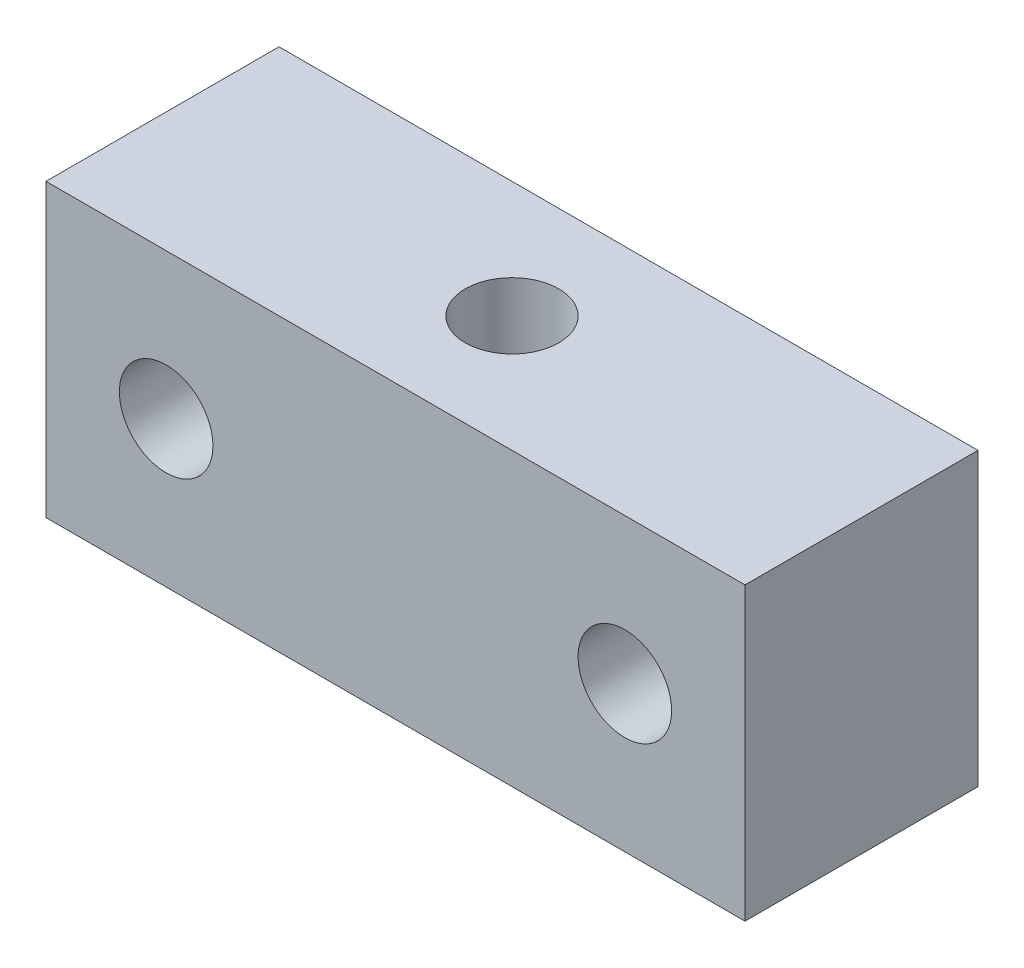
ISO-10303-21;
HEADER;
FILE_DESCRIPTION(('STEP AP214'),'2;1');
FILE_NAME('part.step','',(''),(''),'','','');
FILE_SCHEMA(('AUTOMOTIVE_DESIGN { 1 0 10303 214 1 1 1 1 }'));
ENDSEC;
DATA;
#1=APPLICATION_CONTEXT('core data for automotive mechanical design processes');
#2=APPLICATION_PROTOCOL_DEFINITION('international standard','automotive_design',2000,#1);
#3=PRODUCT_CONTEXT('',#1,'mechanical');
#4=PRODUCT('Part','Part','',(#3));
#5=PRODUCT_RELATED_PRODUCT_CATEGORY('part','',(#4));
#6=PRODUCT_DEFINITION_FORMATION('','',#4);
#7=PRODUCT_DEFINITION_CONTEXT('part definition',#1,'design');
#8=PRODUCT_DEFINITION('design','',#6,#7);
#9=PRODUCT_DEFINITION_SHAPE('','',#8);
#10=(LENGTH_UNIT() NAMED_UNIT(*) SI_UNIT(.MILLI.,.METRE.));
#11=(NAMED_UNIT(*) PLANE_ANGLE_UNIT() SI_UNIT($,.RADIAN.));
#12=(NAMED_UNIT(*) SI_UNIT($,.STERADIAN.) SOLID_ANGLE_UNIT());
#13=UNCERTAINTY_MEASURE_WITH_UNIT(LENGTH_MEASURE(1.E-05),#10,'distance_accuracy_value','');
#14=(GEOMETRIC_REPRESENTATION_CONTEXT(3) GLOBAL_UNCERTAINTY_ASSIGNED_CONTEXT((#13)) GLOBAL_UNIT_ASSIGNED_CONTEXT((#10,
#11,#12)) REPRESENTATION_CONTEXT('',''));
#15=CARTESIAN_POINT('',(0.,0.,0.));
#16=DIRECTION('',(0.,0.,1.));
#17=DIRECTION('',(1.,0.,0.));
#18=AXIS2_PLACEMENT_3D('',#15,#16,#17);
#19=CARTESIAN_POINT('',(0.,0.,25.4));
#20=DIRECTION('',(1.,0.,0.));
#21=DIRECTION('',(0.,0.,-1.));
#22=AXIS2_PLACEMENT_3D('',#19,#20,#21);
#23=PLANE('',#22);
#24=DIRECTION('',(0.,-1.,0.));
#25=VECTOR('',#24,1.);
#26=CARTESIAN_POINT('',(0.,0.,0.));
#27=LINE('',#26,#25);
#28=CARTESIAN_POINT('',(0.,31.75,0.));
#29=VERTEX_POINT('',#28);
#30=CARTESIAN_POINT('',(0.,0.,0.));
#31=VERTEX_POINT('',#30);
#32=EDGE_CURVE('E99',#29,#31,#27,.T.);
#33=ORIENTED_EDGE('',*,*,#32,.T.);
#34=DIRECTION('',(0.,0.,-1.));
#35=VECTOR('',#34,1.);
#36=CARTESIAN_POINT('',(0.,0.,25.4));
#37=LINE('',#36,#35);
#38=CARTESIAN_POINT('',(0.,0.,25.4));
#39=VERTEX_POINT('',#38);
#40=EDGE_CURVE('E11',#39,#31,#37,.T.);
#41=ORIENTED_EDGE('',*,*,#40,.F.);
#42=DIRECTION('',(0.,-1.,0.));
#43=VECTOR('',#42,1.);
#44=CARTESIAN_POINT('',(0.,0.,25.4));
#45=LINE('',#44,#43);
#46=CARTESIAN_POINT('',(0.,31.75,25.4));
#47=VERTEX_POINT('',#46);
#48=EDGE_CURVE('E87',#47,#39,#45,.T.);
#49=ORIENTED_EDGE('',*,*,#48,.F.);
#50=DIRECTION('',(0.,0.,-1.));
#51=VECTOR('',#50,1.);
#52=CARTESIAN_POINT('',(0.,31.75,25.4));
#53=LINE('',#52,#51);
#54=EDGE_CURVE('E95',#47,#29,#53,.T.);
#55=ORIENTED_EDGE('',*,*,#54,.T.);
#56=EDGE_LOOP('',(#33,#41,#49,#55));
#57=FACE_BOUND('',#56,.T.);
#58=ADVANCED_FACE('F36',(#57),#23,.F.);
#59=CARTESIAN_POINT('',(0.,0.,25.4));
#60=DIRECTION('',(0.,1.,0.));
#61=DIRECTION('',(0.,0.,1.));
#62=AXIS2_PLACEMENT_3D('',#59,#60,#61);
#63=PLANE('',#62);
#64=CARTESIAN_POINT('',(38.1,1.59594559789866E-13,12.7));
#65=DIRECTION('',(0.,1.,0.));
#66=DIRECTION('',(0.,0.,1.));
#67=AXIS2_PLACEMENT_3D('',#64,#65,#66);
#68=CIRCLE('',#67,5.09999999999999);
#69=CARTESIAN_POINT('',(38.1,1.59311452918587E-13,17.8));
#70=VERTEX_POINT('',#69);
#71=EDGE_CURVE('E124',#70,#70,#68,.T.);
#72=ORIENTED_EDGE('',*,*,#71,.T.);
#73=EDGE_LOOP('',(#72));
#74=FACE_BOUND('',#73,.T.);
#75=DIRECTION('',(1.,0.,0.));
#76=VECTOR('',#75,1.);
#77=CARTESIAN_POINT('',(0.,0.,0.));
#78=LINE('',#77,#76);
#79=CARTESIAN_POINT('',(76.2,0.,0.));
#80=VERTEX_POINT('',#79);
#81=EDGE_CURVE('E91',#31,#80,#78,.T.);
#82=ORIENTED_EDGE('',*,*,#81,.T.);
#83=DIRECTION('',(0.,0.,-1.));
#84=VECTOR('',#83,1.);
#85=CARTESIAN_POINT('',(76.2,0.,25.4));
#86=LINE('',#85,#84);
#87=CARTESIAN_POINT('',(76.2,0.,25.4));
#88=VERTEX_POINT('',#87);
#89=EDGE_CURVE('E44',#88,#80,#86,.T.);
#90=ORIENTED_EDGE('',*,*,#89,.F.);
#91=DIRECTION('',(1.,0.,0.));
#92=VECTOR('',#91,1.);
#93=CARTESIAN_POINT('',(0.,0.,25.4));
#94=LINE('',#93,#92);
#95=EDGE_CURVE('E82',#39,#88,#94,.T.);
#96=ORIENTED_EDGE('',*,*,#95,.F.);
#97=ORIENTED_EDGE('',*,*,#40,.T.);
#98=EDGE_LOOP('',(#82,#90,#96,#97));
#99=FACE_BOUND('',#98,.T.);
#100=ADVANCED_FACE('F90',(#74,#99),#63,.F.);
#101=CARTESIAN_POINT('',(76.2,0.,25.4));
#102=DIRECTION('',(-1.,0.,0.));
#103=DIRECTION('',(0.,0.,1.));
#104=AXIS2_PLACEMENT_3D('',#101,#102,#103);
#105=PLANE('',#104);
#106=DIRECTION('',(0.,1.,0.));
#107=VECTOR('',#106,1.);
#108=CARTESIAN_POINT('',(76.2,0.,0.));
#109=LINE('',#108,#107);
#110=CARTESIAN_POINT('',(76.2,31.75,0.));
#111=VERTEX_POINT('',#110);
#112=EDGE_CURVE('E69',#80,#111,#109,.T.);
#113=ORIENTED_EDGE('',*,*,#112,.T.);
#114=DIRECTION('',(0.,0.,-1.));
#115=VECTOR('',#114,1.);
#116=CARTESIAN_POINT('',(76.2,31.75,25.4));
#117=LINE('',#116,#115);
#118=CARTESIAN_POINT('',(76.2,31.75,25.4));
#119=VERTEX_POINT('',#118);
#120=EDGE_CURVE('E92',#119,#111,#117,.T.);
#121=ORIENTED_EDGE('',*,*,#120,.F.);
#122=DIRECTION('',(0.,1.,0.));
#123=VECTOR('',#122,1.);
#124=CARTESIAN_POINT('',(76.2,0.,25.4));
#125=LINE('',#124,#123);
#126=EDGE_CURVE('E85',#88,#119,#125,.T.);
#127=ORIENTED_EDGE('',*,*,#126,.F.);
#128=ORIENTED_EDGE('',*,*,#89,.T.);
#129=EDGE_LOOP('',(#113,#121,#127,#128));
#130=FACE_BOUND('',#129,.T.);
#131=ADVANCED_FACE('F93',(#130),#105,.F.);
#132=CARTESIAN_POINT('',(0.,31.75,25.4));
#133=DIRECTION('',(0.,-1.,0.));
#134=DIRECTION('',(0.,0.,-1.));
#135=AXIS2_PLACEMENT_3D('',#132,#133,#134);
#136=PLANE('',#135);
#137=CARTESIAN_POINT('',(38.1,31.75,12.7));
#138=DIRECTION('',(0.,1.,0.));
#139=DIRECTION('',(0.,0.,1.));
#140=AXIS2_PLACEMENT_3D('',#137,#138,#139);
#141=CIRCLE('',#140,5.09999999999999);
#142=CARTESIAN_POINT('',(38.1,31.75,17.8));
#143=VERTEX_POINT('',#142);
#144=EDGE_CURVE('E127',#143,#143,#141,.T.);
#145=ORIENTED_EDGE('',*,*,#144,.F.);
#146=EDGE_LOOP('',(#145));
#147=FACE_BOUND('',#146,.T.);
#148=DIRECTION('',(-1.,0.,0.));
#149=VECTOR('',#148,1.);
#150=CARTESIAN_POINT('',(0.,31.75,0.));
#151=LINE('',#150,#149);
#152=EDGE_CURVE('E75',#111,#29,#151,.T.);
#153=ORIENTED_EDGE('',*,*,#152,.T.);
#154=ORIENTED_EDGE('',*,*,#54,.F.);
#155=DIRECTION('',(-1.,0.,0.));
#156=VECTOR('',#155,1.);
#157=CARTESIAN_POINT('',(0.,31.75,25.4));
#158=LINE('',#157,#156);
#159=EDGE_CURVE('E52',#119,#47,#158,.T.);
#160=ORIENTED_EDGE('',*,*,#159,.F.);
#161=ORIENTED_EDGE('',*,*,#120,.T.);
#162=EDGE_LOOP('',(#153,#154,#160,#161));
#163=FACE_BOUND('',#162,.T.);
#164=ADVANCED_FACE('F107',(#147,#163),#136,.F.);
#165=CARTESIAN_POINT('',(0.,0.,25.4));
#166=DIRECTION('',(0.,0.,-1.));
#167=DIRECTION('',(-1.,0.,0.));
#168=AXIS2_PLACEMENT_3D('',#165,#166,#167);
#169=PLANE('',#168);
#170=CARTESIAN_POINT('',(13.1,15.875,25.4));
#171=DIRECTION('',(0.,0.,1.));
#172=DIRECTION('',(1.,0.,0.));
#173=AXIS2_PLACEMENT_3D('',#170,#171,#172);
#174=CIRCLE('',#173,5.09999999999999);
#175=CARTESIAN_POINT('',(18.2,15.875,25.4));
#176=VERTEX_POINT('',#175);
#177=EDGE_CURVE('E121',#176,#176,#174,.T.);
#178=ORIENTED_EDGE('',*,*,#177,.F.);
#179=EDGE_LOOP('',(#178));
#180=FACE_BOUND('',#179,.T.);
#181=CARTESIAN_POINT('',(63.1,15.875,25.4));
#182=DIRECTION('',(0.,0.,1.));
#183=DIRECTION('',(1.,0.,0.));
#184=AXIS2_PLACEMENT_3D('',#181,#182,#183);
#185=CIRCLE('',#184,5.09999999999999);
#186=CARTESIAN_POINT('',(68.2,15.875,25.4));
#187=VERTEX_POINT('',#186);
#188=EDGE_CURVE('E115',#187,#187,#185,.T.);
#189=ORIENTED_EDGE('',*,*,#188,.F.);
#190=EDGE_LOOP('',(#189));
#191=FACE_BOUND('',#190,.T.);
#192=ORIENTED_EDGE('',*,*,#48,.T.);
#193=ORIENTED_EDGE('',*,*,#95,.T.);
#194=ORIENTED_EDGE('',*,*,#126,.T.);
#195=ORIENTED_EDGE('',*,*,#159,.T.);
#196=EDGE_LOOP('',(#192,#193,#194,#195));
#197=FACE_BOUND('',#196,.T.);
#198=ADVANCED_FACE('F83',(#180,#191,#197),#169,.F.);
#199=CARTESIAN_POINT('',(0.,0.,0.));
#200=DIRECTION('',(0.,0.,-1.));
#201=DIRECTION('',(-1.,0.,0.));
#202=AXIS2_PLACEMENT_3D('',#199,#200,#201);
#203=PLANE('',#202);
#204=CARTESIAN_POINT('',(13.1,15.875,0.));
#205=DIRECTION('',(0.,0.,1.));
#206=DIRECTION('',(1.,0.,0.));
#207=AXIS2_PLACEMENT_3D('',#204,#205,#206);
#208=CIRCLE('',#207,5.09999999999999);
#209=CARTESIAN_POINT('',(18.2,15.875,0.));
#210=VERTEX_POINT('',#209);
#211=EDGE_CURVE('E118',#210,#210,#208,.T.);
#212=ORIENTED_EDGE('',*,*,#211,.T.);
#213=EDGE_LOOP('',(#212));
#214=FACE_BOUND('',#213,.T.);
#215=CARTESIAN_POINT('',(63.1,15.875,0.));
#216=DIRECTION('',(0.,0.,1.));
#217=DIRECTION('',(1.,0.,0.));
#218=AXIS2_PLACEMENT_3D('',#215,#216,#217);
#219=CIRCLE('',#218,5.09999999999999);
#220=CARTESIAN_POINT('',(68.2,15.875,0.));
#221=VERTEX_POINT('',#220);
#222=EDGE_CURVE('E102',#221,#221,#219,.T.);
#223=ORIENTED_EDGE('',*,*,#222,.T.);
#224=EDGE_LOOP('',(#223));
#225=FACE_BOUND('',#224,.T.);
#226=ORIENTED_EDGE('',*,*,#32,.F.);
#227=ORIENTED_EDGE('',*,*,#152,.F.);
#228=ORIENTED_EDGE('',*,*,#112,.F.);
#229=ORIENTED_EDGE('',*,*,#81,.F.);
#230=EDGE_LOOP('',(#226,#227,#228,#229));
#231=FACE_BOUND('',#230,.T.);
#232=ADVANCED_FACE('F110',(#214,#225,#231),#203,.T.);
#233=CARTESIAN_POINT('',(63.1,15.875,25.4));
#234=DIRECTION('',(0.,0.,1.));
#235=DIRECTION('',(1.,0.,0.));
#236=AXIS2_PLACEMENT_3D('',#233,#234,#235);
#237=CYLINDRICAL_SURFACE('',#236,5.09999999999999);
#238=ORIENTED_EDGE('',*,*,#222,.F.);
#239=EDGE_LOOP('',(#238));
#240=FACE_BOUND('',#239,.T.);
#241=ORIENTED_EDGE('',*,*,#188,.T.);
#242=EDGE_LOOP('',(#241));
#243=FACE_BOUND('',#242,.T.);
#244=ADVANCED_FACE('F158',(#240,#243),#237,.F.);
#245=CARTESIAN_POINT('',(13.1,15.875,25.4));
#246=DIRECTION('',(0.,0.,1.));
#247=DIRECTION('',(1.,0.,0.));
#248=AXIS2_PLACEMENT_3D('',#245,#246,#247);
#249=CYLINDRICAL_SURFACE('',#248,5.09999999999999);
#250=ORIENTED_EDGE('',*,*,#211,.F.);
#251=EDGE_LOOP('',(#250));
#252=FACE_BOUND('',#251,.T.);
#253=ORIENTED_EDGE('',*,*,#177,.T.);
#254=EDGE_LOOP('',(#253));
#255=FACE_BOUND('',#254,.T.);
#256=ADVANCED_FACE('F153',(#252,#255),#249,.F.);
#257=CARTESIAN_POINT('',(38.1,31.75,12.7));
#258=DIRECTION('',(0.,1.,0.));
#259=DIRECTION('',(0.,0.,1.));
#260=AXIS2_PLACEMENT_3D('',#257,#258,#259);
#261=CYLINDRICAL_SURFACE('',#260,5.09999999999999);
#262=ORIENTED_EDGE('',*,*,#71,.F.);
#263=EDGE_LOOP('',(#262));
#264=FACE_BOUND('',#263,.T.);
#265=ORIENTED_EDGE('',*,*,#144,.T.);
#266=EDGE_LOOP('',(#265));
#267=FACE_BOUND('',#266,.T.);
#268=ADVANCED_FACE('F131',(#264,#267),#261,.F.);
#269=CLOSED_SHELL('',(#58,#100,#131,#164,#198,#232,#244,#256,#268));
#270=MANIFOLD_SOLID_BREP('B2',#269);
#271=ADVANCED_BREP_SHAPE_REPRESENTATION('',(#18,#270),#14);
#272=SHAPE_DEFINITION_REPRESENTATION(#9,#271);
ENDSEC;
END-ISO-10303-21;
